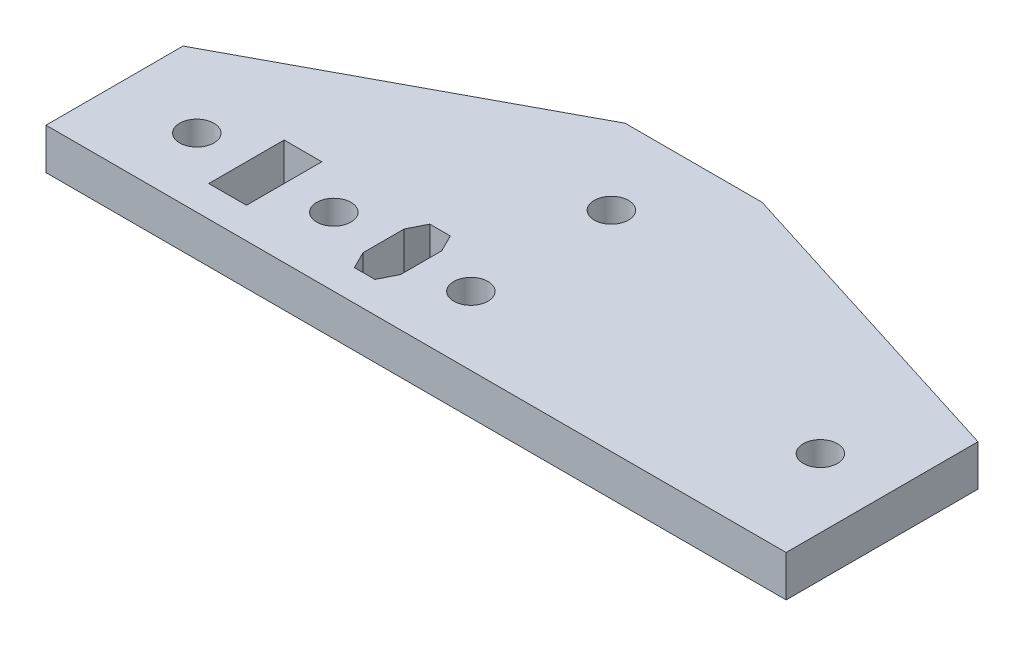
ISO-10303-21;
HEADER;
FILE_DESCRIPTION(('STEP AP214'),'2;1');
FILE_NAME('part.step','',(''),(''),'','','');
FILE_SCHEMA(('AUTOMOTIVE_DESIGN { 1 0 10303 214 1 1 1 1 }'));
ENDSEC;
DATA;
#1=APPLICATION_CONTEXT('core data for automotive mechanical design processes');
#2=APPLICATION_PROTOCOL_DEFINITION('international standard','automotive_design',2000,#1);
#3=PRODUCT_CONTEXT('',#1,'mechanical');
#4=PRODUCT('Part','Part','',(#3));
#5=PRODUCT_RELATED_PRODUCT_CATEGORY('part','',(#4));
#6=PRODUCT_DEFINITION_FORMATION('','',#4);
#7=PRODUCT_DEFINITION_CONTEXT('part definition',#1,'design');
#8=PRODUCT_DEFINITION('design','',#6,#7);
#9=PRODUCT_DEFINITION_SHAPE('','',#8);
#10=(LENGTH_UNIT() NAMED_UNIT(*) SI_UNIT(.MILLI.,.METRE.));
#11=(NAMED_UNIT(*) PLANE_ANGLE_UNIT() SI_UNIT($,.RADIAN.));
#12=(NAMED_UNIT(*) SI_UNIT($,.STERADIAN.) SOLID_ANGLE_UNIT());
#13=UNCERTAINTY_MEASURE_WITH_UNIT(LENGTH_MEASURE(1.E-05),#10,'distance_accuracy_value','');
#14=(GEOMETRIC_REPRESENTATION_CONTEXT(3) GLOBAL_UNCERTAINTY_ASSIGNED_CONTEXT((#13)) GLOBAL_UNIT_ASSIGNED_CONTEXT((#10,
#11,#12)) REPRESENTATION_CONTEXT('',''));
#15=CARTESIAN_POINT('',(0.,0.,0.));
#16=DIRECTION('',(0.,0.,1.));
#17=DIRECTION('',(1.,0.,0.));
#18=AXIS2_PLACEMENT_3D('',#15,#16,#17);
#19=CARTESIAN_POINT('',(0.,6.,0.));
#20=DIRECTION('',(0.,-1.,0.));
#21=DIRECTION('',(0.,0.,-1.));
#22=AXIS2_PLACEMENT_3D('',#19,#20,#21);
#23=PLANE('',#22);
#24=DIRECTION('',(0.,0.,1.));
#25=VECTOR('',#24,1.);
#26=CARTESIAN_POINT('',(19.25,6.,-15.5));
#27=LINE('',#26,#25);
#28=CARTESIAN_POINT('',(19.25,6.,-15.5));
#29=VERTEX_POINT('',#28);
#30=CARTESIAN_POINT('',(19.25,6.,-4.5));
#31=VERTEX_POINT('',#30);
#32=EDGE_CURVE('E257',#29,#31,#27,.T.);
#33=ORIENTED_EDGE('',*,*,#32,.F.);
#34=DIRECTION('',(-1.,0.,0.));
#35=VECTOR('',#34,1.);
#36=CARTESIAN_POINT('',(19.25,6.,-15.5));
#37=LINE('',#36,#35);
#38=CARTESIAN_POINT('',(24.75,6.,-15.5));
#39=VERTEX_POINT('',#38);
#40=EDGE_CURVE('E268',#39,#29,#37,.T.);
#41=ORIENTED_EDGE('',*,*,#40,.F.);
#42=DIRECTION('',(0.,0.,-1.));
#43=VECTOR('',#42,1.);
#44=CARTESIAN_POINT('',(24.75,6.,-15.5));
#45=LINE('',#44,#43);
#46=CARTESIAN_POINT('',(24.75,6.,-4.5));
#47=VERTEX_POINT('',#46);
#48=EDGE_CURVE('E264',#47,#39,#45,.T.);
#49=ORIENTED_EDGE('',*,*,#48,.F.);
#50=DIRECTION('',(1.,0.,0.));
#51=VECTOR('',#50,1.);
#52=CARTESIAN_POINT('',(19.25,6.,-4.5));
#53=LINE('',#52,#51);
#54=EDGE_CURVE('E260',#31,#47,#53,.T.);
#55=ORIENTED_EDGE('',*,*,#54,.F.);
#56=EDGE_LOOP('',(#33,#41,#49,#55));
#57=FACE_BOUND('',#56,.T.);
#58=DIRECTION('',(1.,0.,0.));
#59=VECTOR('',#58,1.);
#60=CARTESIAN_POINT('',(108.,6.,0.));
#61=LINE('',#60,#59);
#62=CARTESIAN_POINT('',(0.,6.,0.));
#63=VERTEX_POINT('',#62);
#64=CARTESIAN_POINT('',(108.,6.,0.));
#65=VERTEX_POINT('',#64);
#66=EDGE_CURVE('E332',#63,#65,#61,.T.);
#67=ORIENTED_EDGE('',*,*,#66,.T.);
#68=DIRECTION('',(0.,0.,-1.));
#69=VECTOR('',#68,1.);
#70=CARTESIAN_POINT('',(108.,6.,-28.));
#71=LINE('',#70,#69);
#72=CARTESIAN_POINT('',(108.,6.,-28.));
#73=VERTEX_POINT('',#72);
#74=EDGE_CURVE('E336',#65,#73,#71,.T.);
#75=ORIENTED_EDGE('',*,*,#74,.T.);
#76=DIRECTION('',(-0.953739212093984,0.,-0.30063518642093));
#77=VECTOR('',#76,1.);
#78=CARTESIAN_POINT('',(62.,6.,-42.5));
#79=LINE('',#78,#77);
#80=CARTESIAN_POINT('',(62.,6.,-42.5));
#81=VERTEX_POINT('',#80);
#82=EDGE_CURVE('E340',#73,#81,#79,.T.);
#83=ORIENTED_EDGE('',*,*,#82,.T.);
#84=DIRECTION('',(-1.,0.,0.));
#85=VECTOR('',#84,1.);
#86=CARTESIAN_POINT('',(42.,6.,-42.5));
#87=LINE('',#86,#85);
#88=CARTESIAN_POINT('',(42.,6.,-42.5));
#89=VERTEX_POINT('',#88);
#90=EDGE_CURVE('E343',#81,#89,#87,.T.);
#91=ORIENTED_EDGE('',*,*,#90,.T.);
#92=DIRECTION('',(-0.881479970028782,0.,0.472221412515419));
#93=VECTOR('',#92,1.);
#94=CARTESIAN_POINT('',(0.,6.,-20.));
#95=LINE('',#94,#93);
#96=CARTESIAN_POINT('',(0.,6.,-20.));
#97=VERTEX_POINT('',#96);
#98=EDGE_CURVE('E346',#89,#97,#95,.T.);
#99=ORIENTED_EDGE('',*,*,#98,.T.);
#100=DIRECTION('',(0.,0.,1.));
#101=VECTOR('',#100,1.);
#102=CARTESIAN_POINT('',(0.,6.,0.));
#103=LINE('',#102,#101);
#104=EDGE_CURVE('E349',#97,#63,#103,.T.);
#105=ORIENTED_EDGE('',*,*,#104,.T.);
#106=EDGE_LOOP('',(#67,#75,#83,#91,#99,#105));
#107=FACE_BOUND('',#106,.T.);
#108=CARTESIAN_POINT('',(52.,6.,-30.5));
#109=DIRECTION('',(0.,1.,0.));
#110=DIRECTION('',(0.,0.,1.));
#111=AXIS2_PLACEMENT_3D('',#108,#109,#110);
#112=CIRCLE('',#111,2.49999999999999);
#113=CARTESIAN_POINT('',(52.,6.,-28.));
#114=VERTEX_POINT('',#113);
#115=EDGE_CURVE('E324',#114,#114,#112,.T.);
#116=ORIENTED_EDGE('',*,*,#115,.F.);
#117=EDGE_LOOP('',(#116));
#118=FACE_BOUND('',#117,.T.);
#119=CARTESIAN_POINT('',(52.,6.,-10.));
#120=DIRECTION('',(0.,1.,0.));
#121=DIRECTION('',(0.,0.,1.));
#122=AXIS2_PLACEMENT_3D('',#119,#120,#121);
#123=CIRCLE('',#122,2.49999999999999);
#124=CARTESIAN_POINT('',(52.,6.,-7.50000000000001));
#125=VERTEX_POINT('',#124);
#126=EDGE_CURVE('E316',#125,#125,#123,.T.);
#127=ORIENTED_EDGE('',*,*,#126,.F.);
#128=EDGE_LOOP('',(#127));
#129=FACE_BOUND('',#128,.T.);
#130=CARTESIAN_POINT('',(32.,6.,-10.));
#131=DIRECTION('',(0.,1.,0.));
#132=DIRECTION('',(0.,0.,1.));
#133=AXIS2_PLACEMENT_3D('',#130,#131,#132);
#134=CIRCLE('',#133,2.49999999999999);
#135=CARTESIAN_POINT('',(32.,6.,-7.50000000000001));
#136=VERTEX_POINT('',#135);
#137=EDGE_CURVE('E308',#136,#136,#134,.T.);
#138=ORIENTED_EDGE('',*,*,#137,.F.);
#139=EDGE_LOOP('',(#138));
#140=FACE_BOUND('',#139,.T.);
#141=CARTESIAN_POINT('',(12.,6.,-10.));
#142=DIRECTION('',(0.,1.,0.));
#143=DIRECTION('',(0.,0.,1.));
#144=AXIS2_PLACEMENT_3D('',#141,#142,#143);
#145=CIRCLE('',#144,2.5);
#146=CARTESIAN_POINT('',(12.,6.,-7.5));
#147=VERTEX_POINT('',#146);
#148=EDGE_CURVE('E300',#147,#147,#145,.T.);
#149=ORIENTED_EDGE('',*,*,#148,.F.);
#150=EDGE_LOOP('',(#149));
#151=FACE_BOUND('',#150,.T.);
#152=DIRECTION('',(-0.447213595499958,0.,0.894427190999916));
#153=VECTOR('',#152,1.);
#154=CARTESIAN_POINT('',(39.25,6.,-13.));
#155=LINE('',#154,#153);
#156=CARTESIAN_POINT('',(40.5,6.,-15.5));
#157=VERTEX_POINT('',#156);
#158=CARTESIAN_POINT('',(39.25,6.,-13.));
#159=VERTEX_POINT('',#158);
#160=EDGE_CURVE('E165',#157,#159,#155,.T.);
#161=ORIENTED_EDGE('',*,*,#160,.F.);
#162=DIRECTION('',(-1.,0.,0.));
#163=VECTOR('',#162,1.);
#164=CARTESIAN_POINT('',(40.5,6.,-15.5));
#165=LINE('',#164,#163);
#166=CARTESIAN_POINT('',(43.5,6.,-15.5));
#167=VERTEX_POINT('',#166);
#168=EDGE_CURVE('E208',#167,#157,#165,.T.);
#169=ORIENTED_EDGE('',*,*,#168,.F.);
#170=DIRECTION('',(-0.447213595499958,0.,-0.894427190999916));
#171=VECTOR('',#170,1.);
#172=CARTESIAN_POINT('',(43.5,6.,-15.5));
#173=LINE('',#172,#171);
#174=CARTESIAN_POINT('',(44.75,6.,-13.));
#175=VERTEX_POINT('',#174);
#176=EDGE_CURVE('E205',#175,#167,#173,.T.);
#177=ORIENTED_EDGE('',*,*,#176,.F.);
#178=DIRECTION('',(0.,0.,-1.));
#179=VECTOR('',#178,1.);
#180=CARTESIAN_POINT('',(44.75,6.,-13.));
#181=LINE('',#180,#179);
#182=CARTESIAN_POINT('',(44.75,6.,-7.));
#183=VERTEX_POINT('',#182);
#184=EDGE_CURVE('E202',#183,#175,#181,.T.);
#185=ORIENTED_EDGE('',*,*,#184,.F.);
#186=DIRECTION('',(0.447213595499956,0.,-0.894427190999917));
#187=VECTOR('',#186,1.);
#188=CARTESIAN_POINT('',(44.75,6.,-7.));
#189=LINE('',#188,#187);
#190=CARTESIAN_POINT('',(43.5,6.,-4.5));
#191=VERTEX_POINT('',#190);
#192=EDGE_CURVE('E199',#191,#183,#189,.T.);
#193=ORIENTED_EDGE('',*,*,#192,.F.);
#194=DIRECTION('',(1.,0.,0.));
#195=VECTOR('',#194,1.);
#196=CARTESIAN_POINT('',(43.5,6.,-4.5));
#197=LINE('',#196,#195);
#198=CARTESIAN_POINT('',(40.5,6.,-4.5));
#199=VERTEX_POINT('',#198);
#200=EDGE_CURVE('E193',#199,#191,#197,.T.);
#201=ORIENTED_EDGE('',*,*,#200,.F.);
#202=DIRECTION('',(0.447213595499958,0.,0.894427190999916));
#203=VECTOR('',#202,1.);
#204=CARTESIAN_POINT('',(40.5,6.,-4.5));
#205=LINE('',#204,#203);
#206=CARTESIAN_POINT('',(39.25,6.,-7.));
#207=VERTEX_POINT('',#206);
#208=EDGE_CURVE('E189',#207,#199,#205,.T.);
#209=ORIENTED_EDGE('',*,*,#208,.F.);
#210=DIRECTION('',(0.,0.,1.));
#211=VECTOR('',#210,1.);
#212=CARTESIAN_POINT('',(39.25,6.,-7.));
#213=LINE('',#212,#211);
#214=EDGE_CURVE('E174',#159,#207,#213,.T.);
#215=ORIENTED_EDGE('',*,*,#214,.F.);
#216=EDGE_LOOP('',(#161,#169,#177,#185,#193,#201,#209,#215));
#217=FACE_BOUND('',#216,.T.);
#218=CARTESIAN_POINT('',(98.,6.,-15.));
#219=DIRECTION('',(0.,1.,0.));
#220=DIRECTION('',(0.,0.,1.));
#221=AXIS2_PLACEMENT_3D('',#218,#219,#220);
#222=CIRCLE('',#221,2.5);
#223=CARTESIAN_POINT('',(98.,6.,-12.5));
#224=VERTEX_POINT('',#223);
#225=EDGE_CURVE('E213',#224,#224,#222,.T.);
#226=ORIENTED_EDGE('',*,*,#225,.F.);
#227=EDGE_LOOP('',(#226));
#228=FACE_BOUND('',#227,.T.);
#229=ADVANCED_FACE('F39',(#57,#107,#118,#129,#140,#151,#217,#228),#23,.F.);
#230=CARTESIAN_POINT('',(0.,0.,0.));
#231=DIRECTION('',(0.,-1.,0.));
#232=DIRECTION('',(0.,0.,-1.));
#233=AXIS2_PLACEMENT_3D('',#230,#231,#232);
#234=PLANE('',#233);
#235=DIRECTION('',(-1.,0.,0.));
#236=VECTOR('',#235,1.);
#237=CARTESIAN_POINT('',(40.5,0.,-15.5));
#238=LINE('',#237,#236);
#239=CARTESIAN_POINT('',(43.5,0.,-15.5));
#240=VERTEX_POINT('',#239);
#241=CARTESIAN_POINT('',(40.5,0.,-15.5));
#242=VERTEX_POINT('',#241);
#243=EDGE_CURVE('E175',#240,#242,#238,.T.);
#244=ORIENTED_EDGE('',*,*,#243,.T.);
#245=DIRECTION('',(-0.447213595499958,0.,0.894427190999916));
#246=VECTOR('',#245,1.);
#247=CARTESIAN_POINT('',(39.25,0.,-13.));
#248=LINE('',#247,#246);
#249=CARTESIAN_POINT('',(39.25,0.,-13.));
#250=VERTEX_POINT('',#249);
#251=EDGE_CURVE('E63',#242,#250,#248,.T.);
#252=ORIENTED_EDGE('',*,*,#251,.T.);
#253=DIRECTION('',(0.,0.,1.));
#254=VECTOR('',#253,1.);
#255=CARTESIAN_POINT('',(39.25,0.,-7.));
#256=LINE('',#255,#254);
#257=CARTESIAN_POINT('',(39.25,0.,-7.));
#258=VERTEX_POINT('',#257);
#259=EDGE_CURVE('E181',#250,#258,#256,.T.);
#260=ORIENTED_EDGE('',*,*,#259,.T.);
#261=DIRECTION('',(0.447213595499958,0.,0.894427190999916));
#262=VECTOR('',#261,1.);
#263=CARTESIAN_POINT('',(40.5,0.,-4.5));
#264=LINE('',#263,#262);
#265=CARTESIAN_POINT('',(40.5,0.,-4.5));
#266=VERTEX_POINT('',#265);
#267=EDGE_CURVE('E216',#258,#266,#264,.T.);
#268=ORIENTED_EDGE('',*,*,#267,.T.);
#269=DIRECTION('',(1.,0.,0.));
#270=VECTOR('',#269,1.);
#271=CARTESIAN_POINT('',(43.5,0.,-4.5));
#272=LINE('',#271,#270);
#273=CARTESIAN_POINT('',(43.5,0.,-4.5));
#274=VERTEX_POINT('',#273);
#275=EDGE_CURVE('E220',#266,#274,#272,.T.);
#276=ORIENTED_EDGE('',*,*,#275,.T.);
#277=DIRECTION('',(0.447213595499956,0.,-0.894427190999917));
#278=VECTOR('',#277,1.);
#279=CARTESIAN_POINT('',(44.75,0.,-7.));
#280=LINE('',#279,#278);
#281=CARTESIAN_POINT('',(44.75,0.,-7.));
#282=VERTEX_POINT('',#281);
#283=EDGE_CURVE('E224',#274,#282,#280,.T.);
#284=ORIENTED_EDGE('',*,*,#283,.T.);
#285=DIRECTION('',(0.,0.,-1.));
#286=VECTOR('',#285,1.);
#287=CARTESIAN_POINT('',(44.75,0.,-13.));
#288=LINE('',#287,#286);
#289=CARTESIAN_POINT('',(44.75,0.,-13.));
#290=VERTEX_POINT('',#289);
#291=EDGE_CURVE('E228',#282,#290,#288,.T.);
#292=ORIENTED_EDGE('',*,*,#291,.T.);
#293=DIRECTION('',(-0.447213595499958,0.,-0.894427190999916));
#294=VECTOR('',#293,1.);
#295=CARTESIAN_POINT('',(43.5,0.,-15.5));
#296=LINE('',#295,#294);
#297=EDGE_CURVE('E232',#290,#240,#296,.T.);
#298=ORIENTED_EDGE('',*,*,#297,.T.);
#299=EDGE_LOOP('',(#244,#252,#260,#268,#276,#284,#292,#298));
#300=FACE_BOUND('',#299,.T.);
#301=DIRECTION('',(-1.,0.,0.));
#302=VECTOR('',#301,1.);
#303=CARTESIAN_POINT('',(19.25,0.,-15.5));
#304=LINE('',#303,#302);
#305=CARTESIAN_POINT('',(24.75,0.,-15.5));
#306=VERTEX_POINT('',#305);
#307=CARTESIAN_POINT('',(19.25,0.,-15.5));
#308=VERTEX_POINT('',#307);
#309=EDGE_CURVE('E261',#306,#308,#304,.T.);
#310=ORIENTED_EDGE('',*,*,#309,.T.);
#311=DIRECTION('',(0.,0.,1.));
#312=VECTOR('',#311,1.);
#313=CARTESIAN_POINT('',(19.25,0.,-15.5));
#314=LINE('',#313,#312);
#315=CARTESIAN_POINT('',(19.25,0.,-4.5));
#316=VERTEX_POINT('',#315);
#317=EDGE_CURVE('E183',#308,#316,#314,.T.);
#318=ORIENTED_EDGE('',*,*,#317,.T.);
#319=DIRECTION('',(1.,0.,0.));
#320=VECTOR('',#319,1.);
#321=CARTESIAN_POINT('',(19.25,0.,-4.5));
#322=LINE('',#321,#320);
#323=CARTESIAN_POINT('',(24.75,0.,-4.5));
#324=VERTEX_POINT('',#323);
#325=EDGE_CURVE('E275',#316,#324,#322,.T.);
#326=ORIENTED_EDGE('',*,*,#325,.T.);
#327=DIRECTION('',(0.,0.,-1.));
#328=VECTOR('',#327,1.);
#329=CARTESIAN_POINT('',(24.75,0.,-15.5));
#330=LINE('',#329,#328);
#331=EDGE_CURVE('E279',#324,#306,#330,.T.);
#332=ORIENTED_EDGE('',*,*,#331,.T.);
#333=EDGE_LOOP('',(#310,#318,#326,#332));
#334=FACE_BOUND('',#333,.T.);
#335=CARTESIAN_POINT('',(12.,0.,-10.));
#336=DIRECTION('',(0.,1.,0.));
#337=DIRECTION('',(0.,0.,1.));
#338=AXIS2_PLACEMENT_3D('',#335,#336,#337);
#339=CIRCLE('',#338,2.5);
#340=CARTESIAN_POINT('',(12.,0.,-7.5));
#341=VERTEX_POINT('',#340);
#342=EDGE_CURVE('E299',#341,#341,#339,.T.);
#343=ORIENTED_EDGE('',*,*,#342,.T.);
#344=EDGE_LOOP('',(#343));
#345=FACE_BOUND('',#344,.T.);
#346=CARTESIAN_POINT('',(52.,0.,-10.));
#347=DIRECTION('',(0.,1.,0.));
#348=DIRECTION('',(0.,0.,1.));
#349=AXIS2_PLACEMENT_3D('',#346,#347,#348);
#350=CIRCLE('',#349,2.49999999999999);
#351=CARTESIAN_POINT('',(52.,0.,-7.50000000000001));
#352=VERTEX_POINT('',#351);
#353=EDGE_CURVE('E312',#352,#352,#350,.T.);
#354=ORIENTED_EDGE('',*,*,#353,.T.);
#355=EDGE_LOOP('',(#354));
#356=FACE_BOUND('',#355,.T.);
#357=DIRECTION('',(1.,0.,0.));
#358=VECTOR('',#357,1.);
#359=CARTESIAN_POINT('',(108.,0.,0.));
#360=LINE('',#359,#358);
#361=CARTESIAN_POINT('',(0.,0.,0.));
#362=VERTEX_POINT('',#361);
#363=CARTESIAN_POINT('',(108.,0.,0.));
#364=VERTEX_POINT('',#363);
#365=EDGE_CURVE('E328',#362,#364,#360,.T.);
#366=ORIENTED_EDGE('',*,*,#365,.F.);
#367=DIRECTION('',(0.,0.,1.));
#368=VECTOR('',#367,1.);
#369=CARTESIAN_POINT('',(0.,0.,0.));
#370=LINE('',#369,#368);
#371=CARTESIAN_POINT('',(0.,0.,-20.));
#372=VERTEX_POINT('',#371);
#373=EDGE_CURVE('E337',#372,#362,#370,.T.);
#374=ORIENTED_EDGE('',*,*,#373,.F.);
#375=DIRECTION('',(-0.881479970028782,0.,0.472221412515419));
#376=VECTOR('',#375,1.);
#377=CARTESIAN_POINT('',(0.,0.,-20.));
#378=LINE('',#377,#376);
#379=CARTESIAN_POINT('',(42.,0.,-42.5));
#380=VERTEX_POINT('',#379);
#381=EDGE_CURVE('E365',#380,#372,#378,.T.);
#382=ORIENTED_EDGE('',*,*,#381,.F.);
#383=DIRECTION('',(-1.,0.,0.));
#384=VECTOR('',#383,1.);
#385=CARTESIAN_POINT('',(42.,0.,-42.5));
#386=LINE('',#385,#384);
#387=CARTESIAN_POINT('',(62.,0.,-42.5));
#388=VERTEX_POINT('',#387);
#389=EDGE_CURVE('E362',#388,#380,#386,.T.);
#390=ORIENTED_EDGE('',*,*,#389,.F.);
#391=DIRECTION('',(-0.953739212093984,0.,-0.30063518642093));
#392=VECTOR('',#391,1.);
#393=CARTESIAN_POINT('',(62.,0.,-42.5));
#394=LINE('',#393,#392);
#395=CARTESIAN_POINT('',(108.,0.,-28.));
#396=VERTEX_POINT('',#395);
#397=EDGE_CURVE('E359',#396,#388,#394,.T.);
#398=ORIENTED_EDGE('',*,*,#397,.F.);
#399=DIRECTION('',(0.,0.,-1.));
#400=VECTOR('',#399,1.);
#401=CARTESIAN_POINT('',(108.,0.,-28.));
#402=LINE('',#401,#400);
#403=EDGE_CURVE('E356',#364,#396,#402,.T.);
#404=ORIENTED_EDGE('',*,*,#403,.F.);
#405=EDGE_LOOP('',(#366,#374,#382,#390,#398,#404));
#406=FACE_BOUND('',#405,.T.);
#407=CARTESIAN_POINT('',(52.,0.,-30.5));
#408=DIRECTION('',(0.,1.,0.));
#409=DIRECTION('',(0.,0.,1.));
#410=AXIS2_PLACEMENT_3D('',#407,#408,#409);
#411=CIRCLE('',#410,2.49999999999999);
#412=CARTESIAN_POINT('',(52.,0.,-28.));
#413=VERTEX_POINT('',#412);
#414=EDGE_CURVE('E320',#413,#413,#411,.T.);
#415=ORIENTED_EDGE('',*,*,#414,.T.);
#416=EDGE_LOOP('',(#415));
#417=FACE_BOUND('',#416,.T.);
#418=CARTESIAN_POINT('',(32.,0.,-10.));
#419=DIRECTION('',(0.,1.,0.));
#420=DIRECTION('',(0.,0.,1.));
#421=AXIS2_PLACEMENT_3D('',#418,#419,#420);
#422=CIRCLE('',#421,2.49999999999999);
#423=CARTESIAN_POINT('',(32.,0.,-7.50000000000001));
#424=VERTEX_POINT('',#423);
#425=EDGE_CURVE('E304',#424,#424,#422,.T.);
#426=ORIENTED_EDGE('',*,*,#425,.T.);
#427=EDGE_LOOP('',(#426));
#428=FACE_BOUND('',#427,.T.);
#429=CARTESIAN_POINT('',(98.,0.,-15.));
#430=DIRECTION('',(0.,1.,0.));
#431=DIRECTION('',(0.,0.,1.));
#432=AXIS2_PLACEMENT_3D('',#429,#430,#431);
#433=CIRCLE('',#432,2.5);
#434=CARTESIAN_POINT('',(98.,0.,-12.5));
#435=VERTEX_POINT('',#434);
#436=EDGE_CURVE('E503',#435,#435,#433,.T.);
#437=ORIENTED_EDGE('',*,*,#436,.T.);
#438=EDGE_LOOP('',(#437));
#439=FACE_BOUND('',#438,.T.);
#440=ADVANCED_FACE('F396',(#300,#334,#345,#356,#406,#417,#428,#439),#234,.T.);
#441=CARTESIAN_POINT('',(108.,6.,0.));
#442=DIRECTION('',(0.,0.,-1.));
#443=DIRECTION('',(-1.,0.,0.));
#444=AXIS2_PLACEMENT_3D('',#441,#442,#443);
#445=PLANE('',#444);
#446=ORIENTED_EDGE('',*,*,#365,.T.);
#447=DIRECTION('',(0.,-1.,0.));
#448=VECTOR('',#447,1.);
#449=CARTESIAN_POINT('',(108.,6.,0.));
#450=LINE('',#449,#448);
#451=EDGE_CURVE('E11',#65,#364,#450,.T.);
#452=ORIENTED_EDGE('',*,*,#451,.F.);
#453=ORIENTED_EDGE('',*,*,#66,.F.);
#454=DIRECTION('',(0.,-1.,0.));
#455=VECTOR('',#454,1.);
#456=CARTESIAN_POINT('',(0.,6.,0.));
#457=LINE('',#456,#455);
#458=EDGE_CURVE('E352',#63,#362,#457,.T.);
#459=ORIENTED_EDGE('',*,*,#458,.T.);
#460=EDGE_LOOP('',(#446,#452,#453,#459));
#461=FACE_BOUND('',#460,.T.);
#462=ADVANCED_FACE('F41',(#461),#445,.F.);
#463=CARTESIAN_POINT('',(108.,6.,-28.));
#464=DIRECTION('',(-1.,0.,0.));
#465=DIRECTION('',(0.,0.,1.));
#466=AXIS2_PLACEMENT_3D('',#463,#464,#465);
#467=PLANE('',#466);
#468=ORIENTED_EDGE('',*,*,#403,.T.);
#469=DIRECTION('',(0.,-1.,0.));
#470=VECTOR('',#469,1.);
#471=CARTESIAN_POINT('',(108.,6.,-28.));
#472=LINE('',#471,#470);
#473=EDGE_CURVE('E48',#73,#396,#472,.T.);
#474=ORIENTED_EDGE('',*,*,#473,.F.);
#475=ORIENTED_EDGE('',*,*,#74,.F.);
#476=ORIENTED_EDGE('',*,*,#451,.T.);
#477=EDGE_LOOP('',(#468,#474,#475,#476));
#478=FACE_BOUND('',#477,.T.);
#479=ADVANCED_FACE('F414',(#478),#467,.F.);
#480=CARTESIAN_POINT('',(62.,6.,-42.5));
#481=DIRECTION('',(-0.30063518642093,0.,0.953739212093984));
#482=DIRECTION('',(0.953739212093984,0.,0.30063518642093));
#483=AXIS2_PLACEMENT_3D('',#480,#481,#482);
#484=PLANE('',#483);
#485=ORIENTED_EDGE('',*,*,#397,.T.);
#486=DIRECTION('',(0.,-1.,0.));
#487=VECTOR('',#486,1.);
#488=CARTESIAN_POINT('',(62.,6.,-42.5));
#489=LINE('',#488,#487);
#490=EDGE_CURVE('E381',#81,#388,#489,.T.);
#491=ORIENTED_EDGE('',*,*,#490,.F.);
#492=ORIENTED_EDGE('',*,*,#82,.F.);
#493=ORIENTED_EDGE('',*,*,#473,.T.);
#494=EDGE_LOOP('',(#485,#491,#492,#493));
#495=FACE_BOUND('',#494,.T.);
#496=ADVANCED_FACE('F390',(#495),#484,.F.);
#497=CARTESIAN_POINT('',(42.,6.,-42.5));
#498=DIRECTION('',(0.,0.,1.));
#499=DIRECTION('',(1.,0.,0.));
#500=AXIS2_PLACEMENT_3D('',#497,#498,#499);
#501=PLANE('',#500);
#502=ORIENTED_EDGE('',*,*,#389,.T.);
#503=DIRECTION('',(0.,-1.,0.));
#504=VECTOR('',#503,1.);
#505=CARTESIAN_POINT('',(42.,6.,-42.5));
#506=LINE('',#505,#504);
#507=EDGE_CURVE('E377',#89,#380,#506,.T.);
#508=ORIENTED_EDGE('',*,*,#507,.F.);
#509=ORIENTED_EDGE('',*,*,#90,.F.);
#510=ORIENTED_EDGE('',*,*,#490,.T.);
#511=EDGE_LOOP('',(#502,#508,#509,#510));
#512=FACE_BOUND('',#511,.T.);
#513=ADVANCED_FACE('F402',(#512),#501,.F.);
#514=CARTESIAN_POINT('',(0.,6.,-20.));
#515=DIRECTION('',(0.472221412515419,0.,0.881479970028782));
#516=DIRECTION('',(0.881479970028782,0.,-0.472221412515419));
#517=AXIS2_PLACEMENT_3D('',#514,#515,#516);
#518=PLANE('',#517);
#519=ORIENTED_EDGE('',*,*,#381,.T.);
#520=DIRECTION('',(0.,-1.,0.));
#521=VECTOR('',#520,1.);
#522=CARTESIAN_POINT('',(0.,6.,-20.));
#523=LINE('',#522,#521);
#524=EDGE_CURVE('E373',#97,#372,#523,.T.);
#525=ORIENTED_EDGE('',*,*,#524,.F.);
#526=ORIENTED_EDGE('',*,*,#98,.F.);
#527=ORIENTED_EDGE('',*,*,#507,.T.);
#528=EDGE_LOOP('',(#519,#525,#526,#527));
#529=FACE_BOUND('',#528,.T.);
#530=ADVANCED_FACE('F406',(#529),#518,.F.);
#531=CARTESIAN_POINT('',(0.,6.,0.));
#532=DIRECTION('',(1.,0.,0.));
#533=DIRECTION('',(0.,0.,-1.));
#534=AXIS2_PLACEMENT_3D('',#531,#532,#533);
#535=PLANE('',#534);
#536=ORIENTED_EDGE('',*,*,#373,.T.);
#537=ORIENTED_EDGE('',*,*,#458,.F.);
#538=ORIENTED_EDGE('',*,*,#104,.F.);
#539=ORIENTED_EDGE('',*,*,#524,.T.);
#540=EDGE_LOOP('',(#536,#537,#538,#539));
#541=FACE_BOUND('',#540,.T.);
#542=ADVANCED_FACE('F417',(#541),#535,.F.);
#543=CARTESIAN_POINT('',(52.,6.,-30.5));
#544=DIRECTION('',(0.,-1.,0.));
#545=DIRECTION('',(0.,0.,-1.));
#546=AXIS2_PLACEMENT_3D('',#543,#544,#545);
#547=CYLINDRICAL_SURFACE('',#546,2.49999999999999);
#548=ORIENTED_EDGE('',*,*,#115,.T.);
#549=EDGE_LOOP('',(#548));
#550=FACE_BOUND('',#549,.T.);
#551=ORIENTED_EDGE('',*,*,#414,.F.);
#552=EDGE_LOOP('',(#551));
#553=FACE_BOUND('',#552,.T.);
#554=ADVANCED_FACE('F419',(#550,#553),#547,.F.);
#555=CARTESIAN_POINT('',(52.,6.,-10.));
#556=DIRECTION('',(0.,-1.,0.));
#557=DIRECTION('',(0.,0.,-1.));
#558=AXIS2_PLACEMENT_3D('',#555,#556,#557);
#559=CYLINDRICAL_SURFACE('',#558,2.49999999999999);
#560=ORIENTED_EDGE('',*,*,#126,.T.);
#561=EDGE_LOOP('',(#560));
#562=FACE_BOUND('',#561,.T.);
#563=ORIENTED_EDGE('',*,*,#353,.F.);
#564=EDGE_LOOP('',(#563));
#565=FACE_BOUND('',#564,.T.);
#566=ADVANCED_FACE('F425',(#562,#565),#559,.F.);
#567=CARTESIAN_POINT('',(32.,6.,-10.));
#568=DIRECTION('',(0.,-1.,0.));
#569=DIRECTION('',(0.,0.,-1.));
#570=AXIS2_PLACEMENT_3D('',#567,#568,#569);
#571=CYLINDRICAL_SURFACE('',#570,2.49999999999999);
#572=ORIENTED_EDGE('',*,*,#137,.T.);
#573=EDGE_LOOP('',(#572));
#574=FACE_BOUND('',#573,.T.);
#575=ORIENTED_EDGE('',*,*,#425,.F.);
#576=EDGE_LOOP('',(#575));
#577=FACE_BOUND('',#576,.T.);
#578=ADVANCED_FACE('F441',(#574,#577),#571,.F.);
#579=CARTESIAN_POINT('',(12.,6.,-10.));
#580=DIRECTION('',(0.,-1.,0.));
#581=DIRECTION('',(0.,0.,-1.));
#582=AXIS2_PLACEMENT_3D('',#579,#580,#581);
#583=CYLINDRICAL_SURFACE('',#582,2.5);
#584=ORIENTED_EDGE('',*,*,#148,.T.);
#585=EDGE_LOOP('',(#584));
#586=FACE_BOUND('',#585,.T.);
#587=ORIENTED_EDGE('',*,*,#342,.F.);
#588=EDGE_LOOP('',(#587));
#589=FACE_BOUND('',#588,.T.);
#590=ADVANCED_FACE('F445',(#586,#589),#583,.F.);
#591=CARTESIAN_POINT('',(19.25,6.,-15.5));
#592=DIRECTION('',(1.,0.,0.));
#593=DIRECTION('',(0.,0.,-1.));
#594=AXIS2_PLACEMENT_3D('',#591,#592,#593);
#595=PLANE('',#594);
#596=ORIENTED_EDGE('',*,*,#317,.F.);
#597=DIRECTION('',(0.,-1.,0.));
#598=VECTOR('',#597,1.);
#599=CARTESIAN_POINT('',(19.25,6.,-15.5));
#600=LINE('',#599,#598);
#601=EDGE_CURVE('E271',#29,#308,#600,.T.);
#602=ORIENTED_EDGE('',*,*,#601,.F.);
#603=ORIENTED_EDGE('',*,*,#32,.T.);
#604=DIRECTION('',(0.,-1.,0.));
#605=VECTOR('',#604,1.);
#606=CARTESIAN_POINT('',(19.25,6.,-4.5));
#607=LINE('',#606,#605);
#608=EDGE_CURVE('E295',#31,#316,#607,.T.);
#609=ORIENTED_EDGE('',*,*,#608,.T.);
#610=EDGE_LOOP('',(#596,#602,#603,#609));
#611=FACE_BOUND('',#610,.T.);
#612=ADVANCED_FACE('F449',(#611),#595,.T.);
#613=CARTESIAN_POINT('',(19.25,6.,-4.5));
#614=DIRECTION('',(0.,0.,-1.));
#615=DIRECTION('',(-1.,0.,0.));
#616=AXIS2_PLACEMENT_3D('',#613,#614,#615);
#617=PLANE('',#616);
#618=ORIENTED_EDGE('',*,*,#325,.F.);
#619=ORIENTED_EDGE('',*,*,#608,.F.);
#620=ORIENTED_EDGE('',*,*,#54,.T.);
#621=DIRECTION('',(0.,-1.,0.));
#622=VECTOR('',#621,1.);
#623=CARTESIAN_POINT('',(24.75,6.,-4.5));
#624=LINE('',#623,#622);
#625=EDGE_CURVE('E292',#47,#324,#624,.T.);
#626=ORIENTED_EDGE('',*,*,#625,.T.);
#627=EDGE_LOOP('',(#618,#619,#620,#626));
#628=FACE_BOUND('',#627,.T.);
#629=ADVANCED_FACE('F453',(#628),#617,.T.);
#630=CARTESIAN_POINT('',(24.75,6.,-15.5));
#631=DIRECTION('',(-1.,0.,0.));
#632=DIRECTION('',(0.,0.,1.));
#633=AXIS2_PLACEMENT_3D('',#630,#631,#632);
#634=PLANE('',#633);
#635=ORIENTED_EDGE('',*,*,#331,.F.);
#636=ORIENTED_EDGE('',*,*,#625,.F.);
#637=ORIENTED_EDGE('',*,*,#48,.T.);
#638=DIRECTION('',(0.,-1.,0.));
#639=VECTOR('',#638,1.);
#640=CARTESIAN_POINT('',(24.75,6.,-15.5));
#641=LINE('',#640,#639);
#642=EDGE_CURVE('E289',#39,#306,#641,.T.);
#643=ORIENTED_EDGE('',*,*,#642,.T.);
#644=EDGE_LOOP('',(#635,#636,#637,#643));
#645=FACE_BOUND('',#644,.T.);
#646=ADVANCED_FACE('F457',(#645),#634,.T.);
#647=CARTESIAN_POINT('',(19.25,6.,-15.5));
#648=DIRECTION('',(0.,0.,1.));
#649=DIRECTION('',(1.,0.,0.));
#650=AXIS2_PLACEMENT_3D('',#647,#648,#649);
#651=PLANE('',#650);
#652=ORIENTED_EDGE('',*,*,#309,.F.);
#653=ORIENTED_EDGE('',*,*,#642,.F.);
#654=ORIENTED_EDGE('',*,*,#40,.T.);
#655=ORIENTED_EDGE('',*,*,#601,.T.);
#656=EDGE_LOOP('',(#652,#653,#654,#655));
#657=FACE_BOUND('',#656,.T.);
#658=ADVANCED_FACE('F461',(#657),#651,.T.);
#659=CARTESIAN_POINT('',(39.25,6.,-13.));
#660=DIRECTION('',(0.894427190999916,0.,0.447213595499958));
#661=DIRECTION('',(0.447213595499958,0.,-0.894427190999916));
#662=AXIS2_PLACEMENT_3D('',#659,#660,#661);
#663=PLANE('',#662);
#664=ORIENTED_EDGE('',*,*,#251,.F.);
#665=DIRECTION('',(0.,-1.,0.));
#666=VECTOR('',#665,1.);
#667=CARTESIAN_POINT('',(40.5,6.,-15.5));
#668=LINE('',#667,#666);
#669=EDGE_CURVE('E169',#157,#242,#668,.T.);
#670=ORIENTED_EDGE('',*,*,#669,.F.);
#671=ORIENTED_EDGE('',*,*,#160,.T.);
#672=DIRECTION('',(0.,-1.,0.));
#673=VECTOR('',#672,1.);
#674=CARTESIAN_POINT('',(39.25,6.,-13.));
#675=LINE('',#674,#673);
#676=EDGE_CURVE('E168',#159,#250,#675,.T.);
#677=ORIENTED_EDGE('',*,*,#676,.T.);
#678=EDGE_LOOP('',(#664,#670,#671,#677));
#679=FACE_BOUND('',#678,.T.);
#680=ADVANCED_FACE('F167',(#679),#663,.T.);
#681=CARTESIAN_POINT('',(39.25,6.,-7.));
#682=DIRECTION('',(1.,0.,0.));
#683=DIRECTION('',(0.,0.,-1.));
#684=AXIS2_PLACEMENT_3D('',#681,#682,#683);
#685=PLANE('',#684);
#686=ORIENTED_EDGE('',*,*,#259,.F.);
#687=ORIENTED_EDGE('',*,*,#676,.F.);
#688=ORIENTED_EDGE('',*,*,#214,.T.);
#689=DIRECTION('',(0.,-1.,0.));
#690=VECTOR('',#689,1.);
#691=CARTESIAN_POINT('',(39.25,6.,-7.));
#692=LINE('',#691,#690);
#693=EDGE_CURVE('E184',#207,#258,#692,.T.);
#694=ORIENTED_EDGE('',*,*,#693,.T.);
#695=EDGE_LOOP('',(#686,#687,#688,#694));
#696=FACE_BOUND('',#695,.T.);
#697=ADVANCED_FACE('F178',(#696),#685,.T.);
#698=CARTESIAN_POINT('',(40.5,6.,-4.5));
#699=DIRECTION('',(0.894427190999916,0.,-0.447213595499958));
#700=DIRECTION('',(-0.447213595499958,0.,-0.894427190999916));
#701=AXIS2_PLACEMENT_3D('',#698,#699,#700);
#702=PLANE('',#701);
#703=ORIENTED_EDGE('',*,*,#267,.F.);
#704=ORIENTED_EDGE('',*,*,#693,.F.);
#705=ORIENTED_EDGE('',*,*,#208,.T.);
#706=DIRECTION('',(0.,-1.,0.));
#707=VECTOR('',#706,1.);
#708=CARTESIAN_POINT('',(40.5,6.,-4.5));
#709=LINE('',#708,#707);
#710=EDGE_CURVE('E252',#199,#266,#709,.T.);
#711=ORIENTED_EDGE('',*,*,#710,.T.);
#712=EDGE_LOOP('',(#703,#704,#705,#711));
#713=FACE_BOUND('',#712,.T.);
#714=ADVANCED_FACE('F470',(#713),#702,.T.);
#715=CARTESIAN_POINT('',(43.5,6.,-4.5));
#716=DIRECTION('',(0.,0.,-1.));
#717=DIRECTION('',(-1.,0.,0.));
#718=AXIS2_PLACEMENT_3D('',#715,#716,#717);
#719=PLANE('',#718);
#720=ORIENTED_EDGE('',*,*,#275,.F.);
#721=ORIENTED_EDGE('',*,*,#710,.F.);
#722=ORIENTED_EDGE('',*,*,#200,.T.);
#723=DIRECTION('',(0.,-1.,0.));
#724=VECTOR('',#723,1.);
#725=CARTESIAN_POINT('',(43.5,6.,-4.5));
#726=LINE('',#725,#724);
#727=EDGE_CURVE('E249',#191,#274,#726,.T.);
#728=ORIENTED_EDGE('',*,*,#727,.T.);
#729=EDGE_LOOP('',(#720,#721,#722,#728));
#730=FACE_BOUND('',#729,.T.);
#731=ADVANCED_FACE('F473',(#730),#719,.T.);
#732=CARTESIAN_POINT('',(44.75,6.,-7.));
#733=DIRECTION('',(-0.894427190999917,0.,-0.447213595499956));
#734=DIRECTION('',(-0.447213595499956,0.,0.894427190999917));
#735=AXIS2_PLACEMENT_3D('',#732,#733,#734);
#736=PLANE('',#735);
#737=ORIENTED_EDGE('',*,*,#283,.F.);
#738=ORIENTED_EDGE('',*,*,#727,.F.);
#739=ORIENTED_EDGE('',*,*,#192,.T.);
#740=DIRECTION('',(0.,-1.,0.));
#741=VECTOR('',#740,1.);
#742=CARTESIAN_POINT('',(44.75,6.,-7.));
#743=LINE('',#742,#741);
#744=EDGE_CURVE('E246',#183,#282,#743,.T.);
#745=ORIENTED_EDGE('',*,*,#744,.T.);
#746=EDGE_LOOP('',(#737,#738,#739,#745));
#747=FACE_BOUND('',#746,.T.);
#748=ADVANCED_FACE('F477',(#747),#736,.T.);
#749=CARTESIAN_POINT('',(44.75,6.,-13.));
#750=DIRECTION('',(-1.,0.,0.));
#751=DIRECTION('',(0.,0.,1.));
#752=AXIS2_PLACEMENT_3D('',#749,#750,#751);
#753=PLANE('',#752);
#754=ORIENTED_EDGE('',*,*,#291,.F.);
#755=ORIENTED_EDGE('',*,*,#744,.F.);
#756=ORIENTED_EDGE('',*,*,#184,.T.);
#757=DIRECTION('',(0.,-1.,0.));
#758=VECTOR('',#757,1.);
#759=CARTESIAN_POINT('',(44.75,6.,-13.));
#760=LINE('',#759,#758);
#761=EDGE_CURVE('E243',#175,#290,#760,.T.);
#762=ORIENTED_EDGE('',*,*,#761,.T.);
#763=EDGE_LOOP('',(#754,#755,#756,#762));
#764=FACE_BOUND('',#763,.T.);
#765=ADVANCED_FACE('F481',(#764),#753,.T.);
#766=CARTESIAN_POINT('',(43.5,6.,-15.5));
#767=DIRECTION('',(-0.894427190999916,0.,0.447213595499958));
#768=DIRECTION('',(0.447213595499958,0.,0.894427190999916));
#769=AXIS2_PLACEMENT_3D('',#766,#767,#768);
#770=PLANE('',#769);
#771=ORIENTED_EDGE('',*,*,#297,.F.);
#772=ORIENTED_EDGE('',*,*,#761,.F.);
#773=ORIENTED_EDGE('',*,*,#176,.T.);
#774=DIRECTION('',(0.,-1.,0.));
#775=VECTOR('',#774,1.);
#776=CARTESIAN_POINT('',(43.5,6.,-15.5));
#777=LINE('',#776,#775);
#778=EDGE_CURVE('E55',#167,#240,#777,.T.);
#779=ORIENTED_EDGE('',*,*,#778,.T.);
#780=EDGE_LOOP('',(#771,#772,#773,#779));
#781=FACE_BOUND('',#780,.T.);
#782=ADVANCED_FACE('F485',(#781),#770,.T.);
#783=CARTESIAN_POINT('',(40.5,6.,-15.5));
#784=DIRECTION('',(0.,0.,1.));
#785=DIRECTION('',(1.,0.,0.));
#786=AXIS2_PLACEMENT_3D('',#783,#784,#785);
#787=PLANE('',#786);
#788=ORIENTED_EDGE('',*,*,#243,.F.);
#789=ORIENTED_EDGE('',*,*,#778,.F.);
#790=ORIENTED_EDGE('',*,*,#168,.T.);
#791=ORIENTED_EDGE('',*,*,#669,.T.);
#792=EDGE_LOOP('',(#788,#789,#790,#791));
#793=FACE_BOUND('',#792,.T.);
#794=ADVANCED_FACE('F489',(#793),#787,.T.);
#795=CARTESIAN_POINT('',(98.,6.,-15.));
#796=DIRECTION('',(0.,-1.,0.));
#797=DIRECTION('',(0.,0.,-1.));
#798=AXIS2_PLACEMENT_3D('',#795,#796,#797);
#799=CYLINDRICAL_SURFACE('',#798,2.5);
#800=ORIENTED_EDGE('',*,*,#225,.T.);
#801=EDGE_LOOP('',(#800));
#802=FACE_BOUND('',#801,.T.);
#803=ORIENTED_EDGE('',*,*,#436,.F.);
#804=EDGE_LOOP('',(#803));
#805=FACE_BOUND('',#804,.T.);
#806=ADVANCED_FACE('F493',(#802,#805),#799,.F.);
#807=CLOSED_SHELL('',(#229,#440,#462,#479,#496,#513,#530,#542,#554,#566,#578,#590,#612,#629,
#646,#658,#680,#697,#714,#731,#748,#765,#782,#794,#806));
#808=MANIFOLD_SOLID_BREP('B2',#807);
#809=ADVANCED_BREP_SHAPE_REPRESENTATION('',(#18,#808),#14);
#810=SHAPE_DEFINITION_REPRESENTATION(#9,#809);
ENDSEC;
END-ISO-10303-21;
